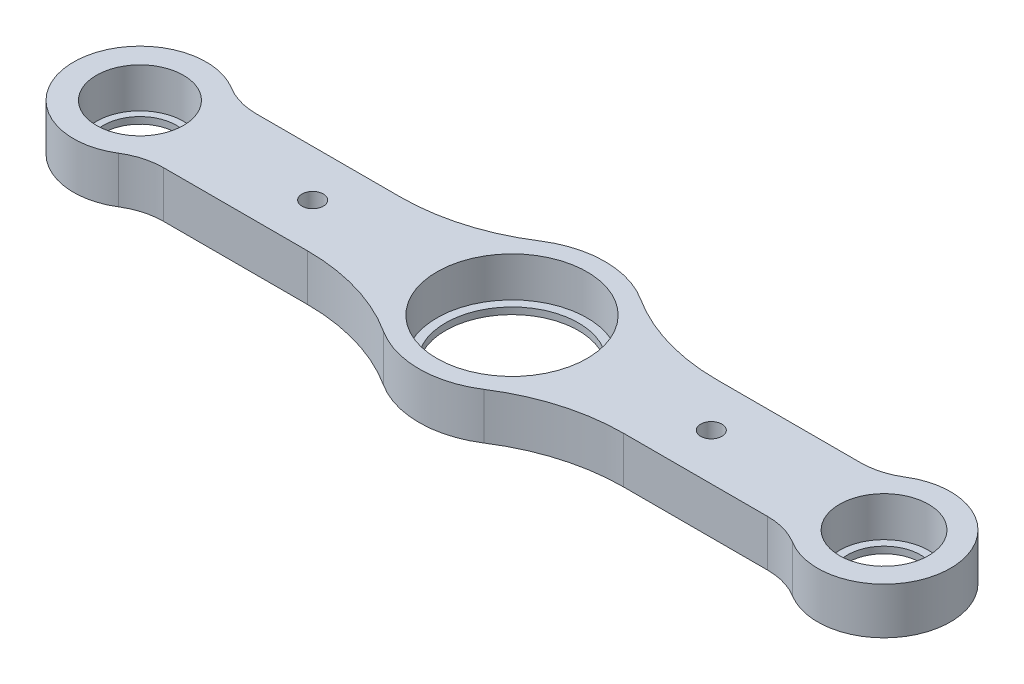
ISO-10303-21;
HEADER;
FILE_DESCRIPTION(('STEP AP214'),'2;1');
FILE_NAME('part.step','',(''),(''),'','','');
FILE_SCHEMA(('AUTOMOTIVE_DESIGN { 1 0 10303 214 1 1 1 1 }'));
ENDSEC;
DATA;
#1=APPLICATION_CONTEXT('core data for automotive mechanical design processes');
#2=APPLICATION_PROTOCOL_DEFINITION('international standard','automotive_design',2000,#1);
#3=PRODUCT_CONTEXT('',#1,'mechanical');
#4=PRODUCT('Part','Part','',(#3));
#5=PRODUCT_RELATED_PRODUCT_CATEGORY('part','',(#4));
#6=PRODUCT_DEFINITION_FORMATION('','',#4);
#7=PRODUCT_DEFINITION_CONTEXT('part definition',#1,'design');
#8=PRODUCT_DEFINITION('design','',#6,#7);
#9=PRODUCT_DEFINITION_SHAPE('','',#8);
#10=(LENGTH_UNIT() NAMED_UNIT(*) SI_UNIT(.MILLI.,.METRE.));
#11=(NAMED_UNIT(*) PLANE_ANGLE_UNIT() SI_UNIT($,.RADIAN.));
#12=(NAMED_UNIT(*) SI_UNIT($,.STERADIAN.) SOLID_ANGLE_UNIT());
#13=UNCERTAINTY_MEASURE_WITH_UNIT(LENGTH_MEASURE(1.E-05),#10,'distance_accuracy_value','');
#14=(GEOMETRIC_REPRESENTATION_CONTEXT(3) GLOBAL_UNCERTAINTY_ASSIGNED_CONTEXT((#13)) GLOBAL_UNIT_ASSIGNED_CONTEXT((#10,
#11,#12)) REPRESENTATION_CONTEXT('',''));
#15=CARTESIAN_POINT('',(0.,0.,0.));
#16=DIRECTION('',(0.,0.,1.));
#17=DIRECTION('',(1.,0.,0.));
#18=AXIS2_PLACEMENT_3D('',#15,#16,#17);
#19=CARTESIAN_POINT('',(0.,7.,0.));
#20=DIRECTION('',(0.,-1.,0.));
#21=DIRECTION('',(0.,0.,-1.));
#22=AXIS2_PLACEMENT_3D('',#19,#20,#21);
#23=CYLINDRICAL_SURFACE('',#22,10.);
#24=CARTESIAN_POINT('',(0.,0.,0.));
#25=DIRECTION('',(0.,1.,0.));
#26=DIRECTION('',(0.,0.,1.));
#27=AXIS2_PLACEMENT_3D('',#24,#25,#26);
#28=CIRCLE('',#27,10.);
#29=CARTESIAN_POINT('',(0.,0.,10.));
#30=VERTEX_POINT('',#29);
#31=EDGE_CURVE('E269',#30,#30,#28,.T.);
#32=ORIENTED_EDGE('',*,*,#31,.F.);
#33=EDGE_LOOP('',(#32));
#34=FACE_BOUND('',#33,.T.);
#35=CARTESIAN_POINT('',(0.,1.,0.));
#36=DIRECTION('',(0.,1.,0.));
#37=DIRECTION('',(0.,0.,1.));
#38=AXIS2_PLACEMENT_3D('',#35,#36,#37);
#39=CIRCLE('',#38,10.);
#40=CARTESIAN_POINT('',(0.,1.,10.));
#41=VERTEX_POINT('',#40);
#42=EDGE_CURVE('E37',#41,#41,#39,.T.);
#43=ORIENTED_EDGE('',*,*,#42,.T.);
#44=EDGE_LOOP('',(#43));
#45=FACE_BOUND('',#44,.T.);
#46=ADVANCED_FACE('F33',(#34,#45),#23,.F.);
#47=CARTESIAN_POINT('',(56.,7.,0.));
#48=DIRECTION('',(0.,-1.,0.));
#49=DIRECTION('',(0.,0.,-1.));
#50=AXIS2_PLACEMENT_3D('',#47,#48,#49);
#51=CYLINDRICAL_SURFACE('',#50,5.5);
#52=CARTESIAN_POINT('',(56.,0.,0.));
#53=DIRECTION('',(0.,1.,0.));
#54=DIRECTION('',(0.,0.,1.));
#55=AXIS2_PLACEMENT_3D('',#52,#53,#54);
#56=CIRCLE('',#55,5.5);
#57=CARTESIAN_POINT('',(56.,0.,5.5));
#58=VERTEX_POINT('',#57);
#59=EDGE_CURVE('E185',#58,#58,#56,.T.);
#60=ORIENTED_EDGE('',*,*,#59,.F.);
#61=EDGE_LOOP('',(#60));
#62=FACE_BOUND('',#61,.T.);
#63=CARTESIAN_POINT('',(56.,1.,0.));
#64=DIRECTION('',(0.,1.,0.));
#65=DIRECTION('',(0.,0.,1.));
#66=AXIS2_PLACEMENT_3D('',#63,#64,#65);
#67=CIRCLE('',#66,5.5);
#68=CARTESIAN_POINT('',(56.,1.,5.5));
#69=VERTEX_POINT('',#68);
#70=EDGE_CURVE('E250',#69,#69,#67,.T.);
#71=ORIENTED_EDGE('',*,*,#70,.T.);
#72=EDGE_LOOP('',(#71));
#73=FACE_BOUND('',#72,.T.);
#74=ADVANCED_FACE('F332',(#62,#73),#51,.F.);
#75=CARTESIAN_POINT('',(-56.,7.,0.));
#76=DIRECTION('',(0.,-1.,0.));
#77=DIRECTION('',(0.,0.,-1.));
#78=AXIS2_PLACEMENT_3D('',#75,#76,#77);
#79=CYLINDRICAL_SURFACE('',#78,5.5);
#80=CARTESIAN_POINT('',(-56.,0.,0.));
#81=DIRECTION('',(0.,1.,0.));
#82=DIRECTION('',(0.,0.,-1.));
#83=AXIS2_PLACEMENT_3D('',#80,#81,#82);
#84=CIRCLE('',#83,5.5);
#85=CARTESIAN_POINT('',(-56.,0.,-5.49999999999998));
#86=VERTEX_POINT('',#85);
#87=EDGE_CURVE('E274',#86,#86,#84,.T.);
#88=ORIENTED_EDGE('',*,*,#87,.F.);
#89=EDGE_LOOP('',(#88));
#90=FACE_BOUND('',#89,.T.);
#91=CARTESIAN_POINT('',(-56.,1.,0.));
#92=DIRECTION('',(0.,1.,0.));
#93=DIRECTION('',(0.,0.,1.));
#94=AXIS2_PLACEMENT_3D('',#91,#92,#93);
#95=CIRCLE('',#94,5.5);
#96=CARTESIAN_POINT('',(-56.,1.,5.50000000000001));
#97=VERTEX_POINT('',#96);
#98=EDGE_CURVE('E248',#97,#97,#95,.T.);
#99=ORIENTED_EDGE('',*,*,#98,.T.);
#100=EDGE_LOOP('',(#99));
#101=FACE_BOUND('',#100,.T.);
#102=ADVANCED_FACE('F338',(#90,#101),#79,.F.);
#103=CARTESIAN_POINT('',(23.8117617995813,7.,-37.));
#104=DIRECTION('',(0.,1.,0.));
#105=DIRECTION('',(0.,0.,1.));
#106=AXIS2_PLACEMENT_3D('',#103,#104,#105);
#107=PLANE('',#106);
#108=CARTESIAN_POINT('',(0.,7.,0.));
#109=DIRECTION('',(0.,1.,0.));
#110=DIRECTION('',(0.,0.,1.));
#111=AXIS2_PLACEMENT_3D('',#108,#109,#110);
#112=CIRCLE('',#111,11.3);
#113=CARTESIAN_POINT('',(0.,7.,11.3));
#114=VERTEX_POINT('',#113);
#115=EDGE_CURVE('E521',#114,#114,#112,.T.);
#116=ORIENTED_EDGE('',*,*,#115,.F.);
#117=EDGE_LOOP('',(#116));
#118=FACE_BOUND('',#117,.T.);
#119=CARTESIAN_POINT('',(-56.,7.,0.));
#120=DIRECTION('',(0.,1.,0.));
#121=DIRECTION('',(0.,0.,1.));
#122=AXIS2_PLACEMENT_3D('',#119,#120,#121);
#123=CIRCLE('',#122,6.55);
#124=CARTESIAN_POINT('',(-56.,7.,6.55000000000001));
#125=VERTEX_POINT('',#124);
#126=EDGE_CURVE('E529',#125,#125,#123,.T.);
#127=ORIENTED_EDGE('',*,*,#126,.F.);
#128=EDGE_LOOP('',(#127));
#129=FACE_BOUND('',#128,.T.);
#130=CARTESIAN_POINT('',(56.,7.,0.));
#131=DIRECTION('',(0.,1.,0.));
#132=DIRECTION('',(0.,0.,1.));
#133=AXIS2_PLACEMENT_3D('',#130,#131,#132);
#134=CIRCLE('',#133,6.7);
#135=CARTESIAN_POINT('',(56.,7.,6.7));
#136=VERTEX_POINT('',#135);
#137=EDGE_CURVE('E523',#136,#136,#134,.T.);
#138=ORIENTED_EDGE('',*,*,#137,.F.);
#139=EDGE_LOOP('',(#138));
#140=FACE_BOUND('',#139,.T.);
#141=CARTESIAN_POINT('',(-30.,7.,0.));
#142=DIRECTION('',(0.,1.,0.));
#143=DIRECTION('',(0.,0.,1.));
#144=AXIS2_PLACEMENT_3D('',#141,#142,#143);
#145=CIRCLE('',#144,1.6);
#146=CARTESIAN_POINT('',(-30.,7.,1.6));
#147=VERTEX_POINT('',#146);
#148=EDGE_CURVE('E266',#147,#147,#145,.T.);
#149=ORIENTED_EDGE('',*,*,#148,.F.);
#150=EDGE_LOOP('',(#149));
#151=FACE_BOUND('',#150,.T.);
#152=CARTESIAN_POINT('',(23.8117617995813,7.,-37.));
#153=DIRECTION('',(0.,-1.,0.));
#154=DIRECTION('',(0.,0.,1.));
#155=AXIS2_PLACEMENT_3D('',#152,#153,#154);
#156=CIRCLE('',#155,30.);
#157=CARTESIAN_POINT('',(23.8117617995813,7.,-7.));
#158=VERTEX_POINT('',#157);
#159=CARTESIAN_POINT('',(7.57646966350315,7.,-11.7727272727273));
#160=VERTEX_POINT('',#159);
#161=EDGE_CURVE('E212',#158,#160,#156,.T.);
#162=ORIENTED_EDGE('',*,*,#161,.T.);
#163=CARTESIAN_POINT('',(0.,7.,0.));
#164=DIRECTION('',(0.,1.,0.));
#165=DIRECTION('',(0.,0.,1.));
#166=AXIS2_PLACEMENT_3D('',#163,#164,#165);
#167=CIRCLE('',#166,14.);
#168=CARTESIAN_POINT('',(-7.57646966350315,7.,-11.7727272727273));
#169=VERTEX_POINT('',#168);
#170=EDGE_CURVE('E119',#160,#169,#167,.T.);
#171=ORIENTED_EDGE('',*,*,#170,.T.);
#172=CARTESIAN_POINT('',(-23.8117617995813,7.,-37.));
#173=DIRECTION('',(0.,-1.,0.));
#174=DIRECTION('',(0.,0.,1.));
#175=AXIS2_PLACEMENT_3D('',#172,#173,#174);
#176=CIRCLE('',#175,30.);
#177=CARTESIAN_POINT('',(-23.8117617995814,7.,-6.99999999999999));
#178=VERTEX_POINT('',#177);
#179=EDGE_CURVE('E281',#169,#178,#176,.T.);
#180=ORIENTED_EDGE('',*,*,#179,.T.);
#181=DIRECTION('',(-1.,0.,0.));
#182=VECTOR('',#181,1.);
#183=CARTESIAN_POINT('',(-23.8117617995814,7.,-6.99999999999998));
#184=LINE('',#183,#182);
#185=CARTESIAN_POINT('',(-45.4643462471474,7.,-7.00000000000004));
#186=VERTEX_POINT('',#185);
#187=EDGE_CURVE('E283',#178,#186,#184,.T.);
#188=ORIENTED_EDGE('',*,*,#187,.T.);
#189=CARTESIAN_POINT('',(-45.4643462471473,7.,-17.));
#190=DIRECTION('',(0.,-1.,0.));
#191=DIRECTION('',(0.,0.,-1.));
#192=AXIS2_PLACEMENT_3D('',#189,#190,#191);
#193=CIRCLE('',#192,10.);
#194=CARTESIAN_POINT('',(-50.7321731235737,7.,-8.50000000000001));
#195=VERTEX_POINT('',#194);
#196=EDGE_CURVE('E285',#186,#195,#193,.T.);
#197=ORIENTED_EDGE('',*,*,#196,.T.);
#198=CARTESIAN_POINT('',(-56.,7.,0.));
#199=DIRECTION('',(0.,1.,0.));
#200=DIRECTION('',(0.,0.,1.));
#201=AXIS2_PLACEMENT_3D('',#198,#199,#200);
#202=CIRCLE('',#201,10.);
#203=CARTESIAN_POINT('',(-50.7321731235736,7.,8.50000000000001));
#204=VERTEX_POINT('',#203);
#205=EDGE_CURVE('E287',#195,#204,#202,.T.);
#206=ORIENTED_EDGE('',*,*,#205,.T.);
#207=CARTESIAN_POINT('',(-45.4643462471473,7.,17.));
#208=DIRECTION('',(0.,-1.,0.));
#209=DIRECTION('',(0.,0.,1.));
#210=AXIS2_PLACEMENT_3D('',#207,#208,#209);
#211=CIRCLE('',#210,10.);
#212=CARTESIAN_POINT('',(-45.4643462471473,7.,7.00000000000002));
#213=VERTEX_POINT('',#212);
#214=EDGE_CURVE('E289',#204,#213,#211,.T.);
#215=ORIENTED_EDGE('',*,*,#214,.T.);
#216=DIRECTION('',(1.,0.,0.));
#217=VECTOR('',#216,1.);
#218=CARTESIAN_POINT('',(-23.8117617995812,7.,7.00000000000002));
#219=LINE('',#218,#217);
#220=CARTESIAN_POINT('',(-23.8117617995812,7.,7.00000000000002));
#221=VERTEX_POINT('',#220);
#222=EDGE_CURVE('E291',#213,#221,#219,.T.);
#223=ORIENTED_EDGE('',*,*,#222,.T.);
#224=CARTESIAN_POINT('',(-23.8117617995813,7.,37.));
#225=DIRECTION('',(0.,-1.,0.));
#226=DIRECTION('',(0.,0.,-1.));
#227=AXIS2_PLACEMENT_3D('',#224,#225,#226);
#228=CIRCLE('',#227,30.);
#229=CARTESIAN_POINT('',(-7.57646966350314,7.,11.7727272727273));
#230=VERTEX_POINT('',#229);
#231=EDGE_CURVE('E293',#221,#230,#228,.T.);
#232=ORIENTED_EDGE('',*,*,#231,.T.);
#233=CARTESIAN_POINT('',(0.,7.,0.));
#234=DIRECTION('',(0.,1.,0.));
#235=DIRECTION('',(0.,0.,1.));
#236=AXIS2_PLACEMENT_3D('',#233,#234,#235);
#237=CIRCLE('',#236,14.);
#238=CARTESIAN_POINT('',(7.57646966350315,7.,11.7727272727273));
#239=VERTEX_POINT('',#238);
#240=EDGE_CURVE('E295',#230,#239,#237,.T.);
#241=ORIENTED_EDGE('',*,*,#240,.T.);
#242=CARTESIAN_POINT('',(23.8117617995813,7.,37.));
#243=DIRECTION('',(0.,-1.,0.));
#244=DIRECTION('',(0.,0.,-1.));
#245=AXIS2_PLACEMENT_3D('',#242,#243,#244);
#246=CIRCLE('',#245,30.);
#247=CARTESIAN_POINT('',(23.8117617995813,7.,7.00000000000001));
#248=VERTEX_POINT('',#247);
#249=EDGE_CURVE('E297',#239,#248,#246,.T.);
#250=ORIENTED_EDGE('',*,*,#249,.T.);
#251=DIRECTION('',(1.,0.,0.));
#252=VECTOR('',#251,1.);
#253=CARTESIAN_POINT('',(45.4643462471473,7.,7.00000000000001));
#254=LINE('',#253,#252);
#255=CARTESIAN_POINT('',(45.4643462471473,7.,7.00000000000001));
#256=VERTEX_POINT('',#255);
#257=EDGE_CURVE('E299',#248,#256,#254,.T.);
#258=ORIENTED_EDGE('',*,*,#257,.T.);
#259=CARTESIAN_POINT('',(45.4643462471473,7.,17.));
#260=DIRECTION('',(0.,-1.,0.));
#261=DIRECTION('',(0.,0.,-1.));
#262=AXIS2_PLACEMENT_3D('',#259,#260,#261);
#263=CIRCLE('',#262,10.);
#264=CARTESIAN_POINT('',(50.7321731235736,7.,8.5));
#265=VERTEX_POINT('',#264);
#266=EDGE_CURVE('E163',#256,#265,#263,.T.);
#267=ORIENTED_EDGE('',*,*,#266,.T.);
#268=CARTESIAN_POINT('',(56.,7.,0.));
#269=DIRECTION('',(0.,1.,0.));
#270=DIRECTION('',(0.,0.,1.));
#271=AXIS2_PLACEMENT_3D('',#268,#269,#270);
#272=CIRCLE('',#271,10.);
#273=CARTESIAN_POINT('',(50.7321731235736,7.,-8.5));
#274=VERTEX_POINT('',#273);
#275=EDGE_CURVE('E156',#265,#274,#272,.T.);
#276=ORIENTED_EDGE('',*,*,#275,.T.);
#277=CARTESIAN_POINT('',(45.4643462471473,7.,-17.));
#278=DIRECTION('',(0.,-1.,0.));
#279=DIRECTION('',(0.,0.,1.));
#280=AXIS2_PLACEMENT_3D('',#277,#278,#279);
#281=CIRCLE('',#280,10.);
#282=CARTESIAN_POINT('',(45.4643462471473,7.,-7.));
#283=VERTEX_POINT('',#282);
#284=EDGE_CURVE('E161',#274,#283,#281,.T.);
#285=ORIENTED_EDGE('',*,*,#284,.T.);
#286=DIRECTION('',(-1.,0.,0.));
#287=VECTOR('',#286,1.);
#288=CARTESIAN_POINT('',(45.4643462471473,7.,-7.));
#289=LINE('',#288,#287);
#290=EDGE_CURVE('E52',#283,#158,#289,.T.);
#291=ORIENTED_EDGE('',*,*,#290,.T.);
#292=EDGE_LOOP('',(#162,#171,#180,#188,#197,#206,#215,#223,#232,#241,#250,#258,#267,#276,#285,#291));
#293=FACE_BOUND('',#292,.T.);
#294=CARTESIAN_POINT('',(30.,7.,0.));
#295=DIRECTION('',(0.,1.,0.));
#296=DIRECTION('',(0.,0.,1.));
#297=AXIS2_PLACEMENT_3D('',#294,#295,#296);
#298=CIRCLE('',#297,1.6);
#299=CARTESIAN_POINT('',(30.,7.,1.6));
#300=VERTEX_POINT('',#299);
#301=EDGE_CURVE('E257',#300,#300,#298,.T.);
#302=ORIENTED_EDGE('',*,*,#301,.F.);
#303=EDGE_LOOP('',(#302));
#304=FACE_BOUND('',#303,.T.);
#305=ADVANCED_FACE('F158',(#118,#129,#140,#151,#293,#304),#107,.T.);
#306=CARTESIAN_POINT('',(23.8117617995813,0.,-37.));
#307=DIRECTION('',(0.,1.,0.));
#308=DIRECTION('',(0.,0.,1.));
#309=AXIS2_PLACEMENT_3D('',#306,#307,#308);
#310=PLANE('',#309);
#311=CARTESIAN_POINT('',(23.8117617995813,0.,-37.));
#312=DIRECTION('',(0.,-1.,0.));
#313=DIRECTION('',(0.,0.,1.));
#314=AXIS2_PLACEMENT_3D('',#311,#312,#313);
#315=CIRCLE('',#314,30.);
#316=CARTESIAN_POINT('',(23.8117617995813,0.,-7.));
#317=VERTEX_POINT('',#316);
#318=CARTESIAN_POINT('',(7.57646966350315,0.,-11.7727272727273));
#319=VERTEX_POINT('',#318);
#320=EDGE_CURVE('E181',#317,#319,#315,.T.);
#321=ORIENTED_EDGE('',*,*,#320,.F.);
#322=DIRECTION('',(-1.,0.,0.));
#323=VECTOR('',#322,1.);
#324=CARTESIAN_POINT('',(45.4643462471473,0.,-7.));
#325=LINE('',#324,#323);
#326=CARTESIAN_POINT('',(45.4643462471473,0.,-7.));
#327=VERTEX_POINT('',#326);
#328=EDGE_CURVE('E111',#327,#317,#325,.T.);
#329=ORIENTED_EDGE('',*,*,#328,.F.);
#330=CARTESIAN_POINT('',(45.4643462471473,0.,-17.));
#331=DIRECTION('',(0.,-1.,0.));
#332=DIRECTION('',(0.,0.,1.));
#333=AXIS2_PLACEMENT_3D('',#330,#331,#332);
#334=CIRCLE('',#333,10.);
#335=CARTESIAN_POINT('',(50.7321731235736,0.,-8.5));
#336=VERTEX_POINT('',#335);
#337=EDGE_CURVE('E105',#336,#327,#334,.T.);
#338=ORIENTED_EDGE('',*,*,#337,.F.);
#339=CARTESIAN_POINT('',(56.,0.,0.));
#340=DIRECTION('',(0.,1.,0.));
#341=DIRECTION('',(0.,0.,1.));
#342=AXIS2_PLACEMENT_3D('',#339,#340,#341);
#343=CIRCLE('',#342,10.);
#344=CARTESIAN_POINT('',(50.7321731235736,0.,8.5));
#345=VERTEX_POINT('',#344);
#346=EDGE_CURVE('E171',#345,#336,#343,.T.);
#347=ORIENTED_EDGE('',*,*,#346,.F.);
#348=CARTESIAN_POINT('',(45.4643462471473,0.,17.));
#349=DIRECTION('',(0.,-1.,0.));
#350=DIRECTION('',(0.,0.,-1.));
#351=AXIS2_PLACEMENT_3D('',#348,#349,#350);
#352=CIRCLE('',#351,10.);
#353=CARTESIAN_POINT('',(45.4643462471473,0.,7.00000000000001));
#354=VERTEX_POINT('',#353);
#355=EDGE_CURVE('E207',#354,#345,#352,.T.);
#356=ORIENTED_EDGE('',*,*,#355,.F.);
#357=DIRECTION('',(1.,0.,0.));
#358=VECTOR('',#357,1.);
#359=CARTESIAN_POINT('',(45.4643462471473,0.,7.00000000000001));
#360=LINE('',#359,#358);
#361=CARTESIAN_POINT('',(23.8117617995813,0.,7.00000000000001));
#362=VERTEX_POINT('',#361);
#363=EDGE_CURVE('E205',#362,#354,#360,.T.);
#364=ORIENTED_EDGE('',*,*,#363,.F.);
#365=CARTESIAN_POINT('',(23.8117617995813,0.,37.));
#366=DIRECTION('',(0.,-1.,0.));
#367=DIRECTION('',(0.,0.,-1.));
#368=AXIS2_PLACEMENT_3D('',#365,#366,#367);
#369=CIRCLE('',#368,30.);
#370=CARTESIAN_POINT('',(7.57646966350315,0.,11.7727272727273));
#371=VERTEX_POINT('',#370);
#372=EDGE_CURVE('E203',#371,#362,#369,.T.);
#373=ORIENTED_EDGE('',*,*,#372,.F.);
#374=CARTESIAN_POINT('',(0.,0.,0.));
#375=DIRECTION('',(0.,1.,0.));
#376=DIRECTION('',(0.,0.,1.));
#377=AXIS2_PLACEMENT_3D('',#374,#375,#376);
#378=CIRCLE('',#377,14.);
#379=CARTESIAN_POINT('',(-7.57646966350314,0.,11.7727272727273));
#380=VERTEX_POINT('',#379);
#381=EDGE_CURVE('E201',#380,#371,#378,.T.);
#382=ORIENTED_EDGE('',*,*,#381,.F.);
#383=CARTESIAN_POINT('',(-23.8117617995813,0.,37.));
#384=DIRECTION('',(0.,-1.,0.));
#385=DIRECTION('',(0.,0.,-1.));
#386=AXIS2_PLACEMENT_3D('',#383,#384,#385);
#387=CIRCLE('',#386,30.);
#388=CARTESIAN_POINT('',(-23.8117617995812,0.,7.00000000000002));
#389=VERTEX_POINT('',#388);
#390=EDGE_CURVE('E199',#389,#380,#387,.T.);
#391=ORIENTED_EDGE('',*,*,#390,.F.);
#392=DIRECTION('',(1.,0.,0.));
#393=VECTOR('',#392,1.);
#394=CARTESIAN_POINT('',(-23.8117617995812,0.,7.00000000000002));
#395=LINE('',#394,#393);
#396=CARTESIAN_POINT('',(-45.4643462471473,0.,7.00000000000002));
#397=VERTEX_POINT('',#396);
#398=EDGE_CURVE('E197',#397,#389,#395,.T.);
#399=ORIENTED_EDGE('',*,*,#398,.F.);
#400=CARTESIAN_POINT('',(-45.4643462471473,0.,17.));
#401=DIRECTION('',(0.,-1.,0.));
#402=DIRECTION('',(0.,0.,1.));
#403=AXIS2_PLACEMENT_3D('',#400,#401,#402);
#404=CIRCLE('',#403,10.);
#405=CARTESIAN_POINT('',(-50.7321731235736,0.,8.50000000000001));
#406=VERTEX_POINT('',#405);
#407=EDGE_CURVE('E195',#406,#397,#404,.T.);
#408=ORIENTED_EDGE('',*,*,#407,.F.);
#409=CARTESIAN_POINT('',(-56.,0.,0.));
#410=DIRECTION('',(0.,1.,0.));
#411=DIRECTION('',(0.,0.,1.));
#412=AXIS2_PLACEMENT_3D('',#409,#410,#411);
#413=CIRCLE('',#412,10.);
#414=CARTESIAN_POINT('',(-50.7321731235737,0.,-8.50000000000001));
#415=VERTEX_POINT('',#414);
#416=EDGE_CURVE('E193',#415,#406,#413,.T.);
#417=ORIENTED_EDGE('',*,*,#416,.F.);
#418=CARTESIAN_POINT('',(-45.4643462471473,0.,-17.));
#419=DIRECTION('',(0.,-1.,0.));
#420=DIRECTION('',(0.,0.,-1.));
#421=AXIS2_PLACEMENT_3D('',#418,#419,#420);
#422=CIRCLE('',#421,10.);
#423=CARTESIAN_POINT('',(-45.4643462471474,0.,-7.00000000000004));
#424=VERTEX_POINT('',#423);
#425=EDGE_CURVE('E191',#424,#415,#422,.T.);
#426=ORIENTED_EDGE('',*,*,#425,.F.);
#427=DIRECTION('',(-1.,0.,0.));
#428=VECTOR('',#427,1.);
#429=CARTESIAN_POINT('',(-23.8117617995814,0.,-6.99999999999998));
#430=LINE('',#429,#428);
#431=CARTESIAN_POINT('',(-23.8117617995814,0.,-6.99999999999999));
#432=VERTEX_POINT('',#431);
#433=EDGE_CURVE('E189',#432,#424,#430,.T.);
#434=ORIENTED_EDGE('',*,*,#433,.F.);
#435=CARTESIAN_POINT('',(-23.8117617995813,0.,-37.));
#436=DIRECTION('',(0.,-1.,0.));
#437=DIRECTION('',(0.,0.,1.));
#438=AXIS2_PLACEMENT_3D('',#435,#436,#437);
#439=CIRCLE('',#438,30.);
#440=CARTESIAN_POINT('',(-7.57646966350315,0.,-11.7727272727273));
#441=VERTEX_POINT('',#440);
#442=EDGE_CURVE('E187',#441,#432,#439,.T.);
#443=ORIENTED_EDGE('',*,*,#442,.F.);
#444=CARTESIAN_POINT('',(0.,0.,0.));
#445=DIRECTION('',(0.,1.,0.));
#446=DIRECTION('',(0.,0.,1.));
#447=AXIS2_PLACEMENT_3D('',#444,#445,#446);
#448=CIRCLE('',#447,14.);
#449=EDGE_CURVE('E184',#319,#441,#448,.T.);
#450=ORIENTED_EDGE('',*,*,#449,.F.);
#451=EDGE_LOOP('',(#321,#329,#338,#347,#356,#364,#373,#382,#391,#399,#408,#417,#426,#434,#443,#450));
#452=FACE_BOUND('',#451,.T.);
#453=ORIENTED_EDGE('',*,*,#59,.T.);
#454=EDGE_LOOP('',(#453));
#455=FACE_BOUND('',#454,.T.);
#456=ORIENTED_EDGE('',*,*,#87,.T.);
#457=EDGE_LOOP('',(#456));
#458=FACE_BOUND('',#457,.T.);
#459=ORIENTED_EDGE('',*,*,#31,.T.);
#460=EDGE_LOOP('',(#459));
#461=FACE_BOUND('',#460,.T.);
#462=CARTESIAN_POINT('',(-30.,0.,0.));
#463=DIRECTION('',(0.,1.,0.));
#464=DIRECTION('',(0.,0.,1.));
#465=AXIS2_PLACEMENT_3D('',#462,#463,#464);
#466=CIRCLE('',#465,1.6);
#467=CARTESIAN_POINT('',(-30.,0.,1.6));
#468=VERTEX_POINT('',#467);
#469=EDGE_CURVE('E262',#468,#468,#466,.T.);
#470=ORIENTED_EDGE('',*,*,#469,.T.);
#471=EDGE_LOOP('',(#470));
#472=FACE_BOUND('',#471,.T.);
#473=CARTESIAN_POINT('',(30.,0.,0.));
#474=DIRECTION('',(0.,1.,0.));
#475=DIRECTION('',(0.,0.,1.));
#476=AXIS2_PLACEMENT_3D('',#473,#474,#475);
#477=CIRCLE('',#476,1.6);
#478=CARTESIAN_POINT('',(30.,0.,1.6));
#479=VERTEX_POINT('',#478);
#480=EDGE_CURVE('E253',#479,#479,#477,.T.);
#481=ORIENTED_EDGE('',*,*,#480,.T.);
#482=EDGE_LOOP('',(#481));
#483=FACE_BOUND('',#482,.T.);
#484=ADVANCED_FACE('F312',(#452,#455,#458,#461,#472,#483),#310,.F.);
#485=CARTESIAN_POINT('',(23.8117617995813,7.,-37.));
#486=DIRECTION('',(0.,-1.,0.));
#487=DIRECTION('',(0.,0.,-1.));
#488=AXIS2_PLACEMENT_3D('',#485,#486,#487);
#489=CYLINDRICAL_SURFACE('',#488,30.);
#490=ORIENTED_EDGE('',*,*,#320,.T.);
#491=DIRECTION('',(0.,-1.,0.));
#492=VECTOR('',#491,1.);
#493=CARTESIAN_POINT('',(7.57646966350315,7.,-11.7727272727273));
#494=LINE('',#493,#492);
#495=EDGE_CURVE('E11',#160,#319,#494,.T.);
#496=ORIENTED_EDGE('',*,*,#495,.F.);
#497=ORIENTED_EDGE('',*,*,#161,.F.);
#498=DIRECTION('',(0.,-1.,0.));
#499=VECTOR('',#498,1.);
#500=CARTESIAN_POINT('',(23.8117617995813,7.,-7.));
#501=LINE('',#500,#499);
#502=EDGE_CURVE('E177',#158,#317,#501,.T.);
#503=ORIENTED_EDGE('',*,*,#502,.T.);
#504=EDGE_LOOP('',(#490,#496,#497,#503));
#505=FACE_BOUND('',#504,.T.);
#506=ADVANCED_FACE('F35',(#505),#489,.F.);
#507=CARTESIAN_POINT('',(0.,7.,0.));
#508=DIRECTION('',(0.,-1.,0.));
#509=DIRECTION('',(0.,0.,-1.));
#510=AXIS2_PLACEMENT_3D('',#507,#508,#509);
#511=CYLINDRICAL_SURFACE('',#510,14.);
#512=ORIENTED_EDGE('',*,*,#449,.T.);
#513=DIRECTION('',(0.,-1.,0.));
#514=VECTOR('',#513,1.);
#515=CARTESIAN_POINT('',(-7.57646966350315,7.,-11.7727272727273));
#516=LINE('',#515,#514);
#517=EDGE_CURVE('E43',#169,#441,#516,.T.);
#518=ORIENTED_EDGE('',*,*,#517,.F.);
#519=ORIENTED_EDGE('',*,*,#170,.F.);
#520=ORIENTED_EDGE('',*,*,#495,.T.);
#521=EDGE_LOOP('',(#512,#518,#519,#520));
#522=FACE_BOUND('',#521,.T.);
#523=ADVANCED_FACE('F354',(#522),#511,.T.);
#524=CARTESIAN_POINT('',(-23.8117617995813,7.,-37.));
#525=DIRECTION('',(0.,-1.,0.));
#526=DIRECTION('',(0.,0.,-1.));
#527=AXIS2_PLACEMENT_3D('',#524,#525,#526);
#528=CYLINDRICAL_SURFACE('',#527,30.);
#529=ORIENTED_EDGE('',*,*,#442,.T.);
#530=DIRECTION('',(0.,-1.,0.));
#531=VECTOR('',#530,1.);
#532=CARTESIAN_POINT('',(-23.8117617995814,7.,-6.99999999999999));
#533=LINE('',#532,#531);
#534=EDGE_CURVE('E243',#178,#432,#533,.T.);
#535=ORIENTED_EDGE('',*,*,#534,.F.);
#536=ORIENTED_EDGE('',*,*,#179,.F.);
#537=ORIENTED_EDGE('',*,*,#517,.T.);
#538=EDGE_LOOP('',(#529,#535,#536,#537));
#539=FACE_BOUND('',#538,.T.);
#540=ADVANCED_FACE('F358',(#539),#528,.F.);
#541=CARTESIAN_POINT('',(-23.8117617995814,7.,-6.99999999999998));
#542=DIRECTION('',(0.,0.,1.));
#543=DIRECTION('',(1.,0.,0.));
#544=AXIS2_PLACEMENT_3D('',#541,#542,#543);
#545=PLANE('',#544);
#546=ORIENTED_EDGE('',*,*,#433,.T.);
#547=DIRECTION('',(0.,-1.,0.));
#548=VECTOR('',#547,1.);
#549=CARTESIAN_POINT('',(-45.4643462471474,7.,-7.00000000000004));
#550=LINE('',#549,#548);
#551=EDGE_CURVE('E240',#186,#424,#550,.T.);
#552=ORIENTED_EDGE('',*,*,#551,.F.);
#553=ORIENTED_EDGE('',*,*,#187,.F.);
#554=ORIENTED_EDGE('',*,*,#534,.T.);
#555=EDGE_LOOP('',(#546,#552,#553,#554));
#556=FACE_BOUND('',#555,.T.);
#557=ADVANCED_FACE('F362',(#556),#545,.F.);
#558=CARTESIAN_POINT('',(-45.4643462471473,7.,-17.));
#559=DIRECTION('',(0.,-1.,0.));
#560=DIRECTION('',(0.,0.,-1.));
#561=AXIS2_PLACEMENT_3D('',#558,#559,#560);
#562=CYLINDRICAL_SURFACE('',#561,10.);
#563=ORIENTED_EDGE('',*,*,#425,.T.);
#564=DIRECTION('',(0.,-1.,0.));
#565=VECTOR('',#564,1.);
#566=CARTESIAN_POINT('',(-50.7321731235737,7.,-8.50000000000001));
#567=LINE('',#566,#565);
#568=EDGE_CURVE('E237',#195,#415,#567,.T.);
#569=ORIENTED_EDGE('',*,*,#568,.F.);
#570=ORIENTED_EDGE('',*,*,#196,.F.);
#571=ORIENTED_EDGE('',*,*,#551,.T.);
#572=EDGE_LOOP('',(#563,#569,#570,#571));
#573=FACE_BOUND('',#572,.T.);
#574=ADVANCED_FACE('F368',(#573),#562,.F.);
#575=CARTESIAN_POINT('',(-56.,7.,0.));
#576=DIRECTION('',(0.,-1.,0.));
#577=DIRECTION('',(0.,0.,-1.));
#578=AXIS2_PLACEMENT_3D('',#575,#576,#577);
#579=CYLINDRICAL_SURFACE('',#578,10.);
#580=ORIENTED_EDGE('',*,*,#416,.T.);
#581=DIRECTION('',(0.,-1.,0.));
#582=VECTOR('',#581,1.);
#583=CARTESIAN_POINT('',(-50.7321731235736,7.,8.50000000000001));
#584=LINE('',#583,#582);
#585=EDGE_CURVE('E234',#204,#406,#584,.T.);
#586=ORIENTED_EDGE('',*,*,#585,.F.);
#587=ORIENTED_EDGE('',*,*,#205,.F.);
#588=ORIENTED_EDGE('',*,*,#568,.T.);
#589=EDGE_LOOP('',(#580,#586,#587,#588));
#590=FACE_BOUND('',#589,.T.);
#591=ADVANCED_FACE('F372',(#590),#579,.T.);
#592=CARTESIAN_POINT('',(-45.4643462471473,7.,17.));
#593=DIRECTION('',(0.,-1.,0.));
#594=DIRECTION('',(0.,0.,-1.));
#595=AXIS2_PLACEMENT_3D('',#592,#593,#594);
#596=CYLINDRICAL_SURFACE('',#595,10.);
#597=ORIENTED_EDGE('',*,*,#407,.T.);
#598=DIRECTION('',(0.,-1.,0.));
#599=VECTOR('',#598,1.);
#600=CARTESIAN_POINT('',(-45.4643462471473,7.,7.00000000000002));
#601=LINE('',#600,#599);
#602=EDGE_CURVE('E231',#213,#397,#601,.T.);
#603=ORIENTED_EDGE('',*,*,#602,.F.);
#604=ORIENTED_EDGE('',*,*,#214,.F.);
#605=ORIENTED_EDGE('',*,*,#585,.T.);
#606=EDGE_LOOP('',(#597,#603,#604,#605));
#607=FACE_BOUND('',#606,.T.);
#608=ADVANCED_FACE('F376',(#607),#596,.F.);
#609=CARTESIAN_POINT('',(-23.8117617995812,7.,7.00000000000002));
#610=DIRECTION('',(0.,0.,-1.));
#611=DIRECTION('',(-1.,0.,0.));
#612=AXIS2_PLACEMENT_3D('',#609,#610,#611);
#613=PLANE('',#612);
#614=ORIENTED_EDGE('',*,*,#398,.T.);
#615=DIRECTION('',(0.,-1.,0.));
#616=VECTOR('',#615,1.);
#617=CARTESIAN_POINT('',(-23.8117617995812,7.,7.00000000000002));
#618=LINE('',#617,#616);
#619=EDGE_CURVE('E228',#221,#389,#618,.T.);
#620=ORIENTED_EDGE('',*,*,#619,.F.);
#621=ORIENTED_EDGE('',*,*,#222,.F.);
#622=ORIENTED_EDGE('',*,*,#602,.T.);
#623=EDGE_LOOP('',(#614,#620,#621,#622));
#624=FACE_BOUND('',#623,.T.);
#625=ADVANCED_FACE('F380',(#624),#613,.F.);
#626=CARTESIAN_POINT('',(-23.8117617995813,7.,37.));
#627=DIRECTION('',(0.,-1.,0.));
#628=DIRECTION('',(0.,0.,-1.));
#629=AXIS2_PLACEMENT_3D('',#626,#627,#628);
#630=CYLINDRICAL_SURFACE('',#629,30.);
#631=ORIENTED_EDGE('',*,*,#390,.T.);
#632=DIRECTION('',(0.,-1.,0.));
#633=VECTOR('',#632,1.);
#634=CARTESIAN_POINT('',(-7.57646966350314,7.,11.7727272727273));
#635=LINE('',#634,#633);
#636=EDGE_CURVE('E225',#230,#380,#635,.T.);
#637=ORIENTED_EDGE('',*,*,#636,.F.);
#638=ORIENTED_EDGE('',*,*,#231,.F.);
#639=ORIENTED_EDGE('',*,*,#619,.T.);
#640=EDGE_LOOP('',(#631,#637,#638,#639));
#641=FACE_BOUND('',#640,.T.);
#642=ADVANCED_FACE('F384',(#641),#630,.F.);
#643=CARTESIAN_POINT('',(0.,7.,0.));
#644=DIRECTION('',(0.,-1.,0.));
#645=DIRECTION('',(0.,0.,-1.));
#646=AXIS2_PLACEMENT_3D('',#643,#644,#645);
#647=CYLINDRICAL_SURFACE('',#646,14.);
#648=ORIENTED_EDGE('',*,*,#381,.T.);
#649=DIRECTION('',(0.,-1.,0.));
#650=VECTOR('',#649,1.);
#651=CARTESIAN_POINT('',(7.57646966350315,7.,11.7727272727273));
#652=LINE('',#651,#650);
#653=EDGE_CURVE('E222',#239,#371,#652,.T.);
#654=ORIENTED_EDGE('',*,*,#653,.F.);
#655=ORIENTED_EDGE('',*,*,#240,.F.);
#656=ORIENTED_EDGE('',*,*,#636,.T.);
#657=EDGE_LOOP('',(#648,#654,#655,#656));
#658=FACE_BOUND('',#657,.T.);
#659=ADVANCED_FACE('F388',(#658),#647,.T.);
#660=CARTESIAN_POINT('',(23.8117617995813,7.,37.));
#661=DIRECTION('',(0.,-1.,0.));
#662=DIRECTION('',(0.,0.,-1.));
#663=AXIS2_PLACEMENT_3D('',#660,#661,#662);
#664=CYLINDRICAL_SURFACE('',#663,30.);
#665=ORIENTED_EDGE('',*,*,#372,.T.);
#666=DIRECTION('',(0.,-1.,0.));
#667=VECTOR('',#666,1.);
#668=CARTESIAN_POINT('',(23.8117617995813,7.,7.00000000000001));
#669=LINE('',#668,#667);
#670=EDGE_CURVE('E219',#248,#362,#669,.T.);
#671=ORIENTED_EDGE('',*,*,#670,.F.);
#672=ORIENTED_EDGE('',*,*,#249,.F.);
#673=ORIENTED_EDGE('',*,*,#653,.T.);
#674=EDGE_LOOP('',(#665,#671,#672,#673));
#675=FACE_BOUND('',#674,.T.);
#676=ADVANCED_FACE('F392',(#675),#664,.F.);
#677=CARTESIAN_POINT('',(45.4643462471473,7.,7.00000000000001));
#678=DIRECTION('',(0.,0.,-1.));
#679=DIRECTION('',(-1.,0.,0.));
#680=AXIS2_PLACEMENT_3D('',#677,#678,#679);
#681=PLANE('',#680);
#682=ORIENTED_EDGE('',*,*,#363,.T.);
#683=DIRECTION('',(0.,-1.,0.));
#684=VECTOR('',#683,1.);
#685=CARTESIAN_POINT('',(45.4643462471473,7.,7.00000000000001));
#686=LINE('',#685,#684);
#687=EDGE_CURVE('E216',#256,#354,#686,.T.);
#688=ORIENTED_EDGE('',*,*,#687,.F.);
#689=ORIENTED_EDGE('',*,*,#257,.F.);
#690=ORIENTED_EDGE('',*,*,#670,.T.);
#691=EDGE_LOOP('',(#682,#688,#689,#690));
#692=FACE_BOUND('',#691,.T.);
#693=ADVANCED_FACE('F305',(#692),#681,.F.);
#694=CARTESIAN_POINT('',(45.4643462471473,7.,17.));
#695=DIRECTION('',(0.,-1.,0.));
#696=DIRECTION('',(0.,0.,-1.));
#697=AXIS2_PLACEMENT_3D('',#694,#695,#696);
#698=CYLINDRICAL_SURFACE('',#697,10.);
#699=ORIENTED_EDGE('',*,*,#355,.T.);
#700=DIRECTION('',(0.,-1.,0.));
#701=VECTOR('',#700,1.);
#702=CARTESIAN_POINT('',(50.7321731235736,7.,8.5));
#703=LINE('',#702,#701);
#704=EDGE_CURVE('E172',#265,#345,#703,.T.);
#705=ORIENTED_EDGE('',*,*,#704,.F.);
#706=ORIENTED_EDGE('',*,*,#266,.F.);
#707=ORIENTED_EDGE('',*,*,#687,.T.);
#708=EDGE_LOOP('',(#699,#705,#706,#707));
#709=FACE_BOUND('',#708,.T.);
#710=ADVANCED_FACE('F309',(#709),#698,.F.);
#711=CARTESIAN_POINT('',(56.,7.,0.));
#712=DIRECTION('',(0.,-1.,0.));
#713=DIRECTION('',(0.,0.,-1.));
#714=AXIS2_PLACEMENT_3D('',#711,#712,#713);
#715=CYLINDRICAL_SURFACE('',#714,10.);
#716=ORIENTED_EDGE('',*,*,#346,.T.);
#717=DIRECTION('',(0.,-1.,0.));
#718=VECTOR('',#717,1.);
#719=CARTESIAN_POINT('',(50.7321731235736,7.,-8.5));
#720=LINE('',#719,#718);
#721=EDGE_CURVE('E168',#274,#336,#720,.T.);
#722=ORIENTED_EDGE('',*,*,#721,.F.);
#723=ORIENTED_EDGE('',*,*,#275,.F.);
#724=ORIENTED_EDGE('',*,*,#704,.T.);
#725=EDGE_LOOP('',(#716,#722,#723,#724));
#726=FACE_BOUND('',#725,.T.);
#727=ADVANCED_FACE('F169',(#726),#715,.T.);
#728=CARTESIAN_POINT('',(45.4643462471473,7.,-17.));
#729=DIRECTION('',(0.,-1.,0.));
#730=DIRECTION('',(0.,0.,-1.));
#731=AXIS2_PLACEMENT_3D('',#728,#729,#730);
#732=CYLINDRICAL_SURFACE('',#731,10.);
#733=ORIENTED_EDGE('',*,*,#337,.T.);
#734=DIRECTION('',(0.,-1.,0.));
#735=VECTOR('',#734,1.);
#736=CARTESIAN_POINT('',(45.4643462471473,7.,-7.));
#737=LINE('',#736,#735);
#738=EDGE_CURVE('E173',#283,#327,#737,.T.);
#739=ORIENTED_EDGE('',*,*,#738,.F.);
#740=ORIENTED_EDGE('',*,*,#284,.F.);
#741=ORIENTED_EDGE('',*,*,#721,.T.);
#742=EDGE_LOOP('',(#733,#739,#740,#741));
#743=FACE_BOUND('',#742,.T.);
#744=ADVANCED_FACE('F175',(#743),#732,.F.);
#745=CARTESIAN_POINT('',(45.4643462471473,7.,-7.));
#746=DIRECTION('',(0.,0.,1.));
#747=DIRECTION('',(1.,0.,0.));
#748=AXIS2_PLACEMENT_3D('',#745,#746,#747);
#749=PLANE('',#748);
#750=ORIENTED_EDGE('',*,*,#328,.T.);
#751=ORIENTED_EDGE('',*,*,#502,.F.);
#752=ORIENTED_EDGE('',*,*,#290,.F.);
#753=ORIENTED_EDGE('',*,*,#738,.T.);
#754=EDGE_LOOP('',(#750,#751,#752,#753));
#755=FACE_BOUND('',#754,.T.);
#756=ADVANCED_FACE('F318',(#755),#749,.F.);
#757=CARTESIAN_POINT('',(-30.,7.,0.));
#758=DIRECTION('',(0.,-1.,0.));
#759=DIRECTION('',(0.,0.,-1.));
#760=AXIS2_PLACEMENT_3D('',#757,#758,#759);
#761=CYLINDRICAL_SURFACE('',#760,1.6);
#762=ORIENTED_EDGE('',*,*,#148,.T.);
#763=EDGE_LOOP('',(#762));
#764=FACE_BOUND('',#763,.T.);
#765=ORIENTED_EDGE('',*,*,#469,.F.);
#766=EDGE_LOOP('',(#765));
#767=FACE_BOUND('',#766,.T.);
#768=ADVANCED_FACE('F320',(#764,#767),#761,.F.);
#769=CARTESIAN_POINT('',(30.,7.,0.));
#770=DIRECTION('',(0.,-1.,0.));
#771=DIRECTION('',(0.,0.,-1.));
#772=AXIS2_PLACEMENT_3D('',#769,#770,#771);
#773=CYLINDRICAL_SURFACE('',#772,1.6);
#774=ORIENTED_EDGE('',*,*,#301,.T.);
#775=EDGE_LOOP('',(#774));
#776=FACE_BOUND('',#775,.T.);
#777=ORIENTED_EDGE('',*,*,#480,.F.);
#778=EDGE_LOOP('',(#777));
#779=FACE_BOUND('',#778,.T.);
#780=ADVANCED_FACE('F326',(#776,#779),#773,.F.);
#781=CARTESIAN_POINT('',(-56.,1.,0.));
#782=DIRECTION('',(0.,1.,0.));
#783=DIRECTION('',(0.,0.,1.));
#784=AXIS2_PLACEMENT_3D('',#781,#782,#783);
#785=CYLINDRICAL_SURFACE('',#784,6.55);
#786=CARTESIAN_POINT('',(-56.,1.,0.));
#787=DIRECTION('',(0.,1.,0.));
#788=DIRECTION('',(0.,0.,1.));
#789=AXIS2_PLACEMENT_3D('',#786,#787,#788);
#790=CIRCLE('',#789,6.55);
#791=CARTESIAN_POINT('',(-56.,1.,6.55000000000001));
#792=VERTEX_POINT('',#791);
#793=EDGE_CURVE('E251',#792,#792,#790,.T.);
#794=ORIENTED_EDGE('',*,*,#793,.F.);
#795=EDGE_LOOP('',(#794));
#796=FACE_BOUND('',#795,.T.);
#797=ORIENTED_EDGE('',*,*,#126,.T.);
#798=EDGE_LOOP('',(#797));
#799=FACE_BOUND('',#798,.T.);
#800=ADVANCED_FACE('F429',(#796,#799),#785,.F.);
#801=CARTESIAN_POINT('',(-56.,1.,0.));
#802=DIRECTION('',(0.,1.,0.));
#803=DIRECTION('',(0.,0.,1.));
#804=AXIS2_PLACEMENT_3D('',#801,#802,#803);
#805=PLANE('',#804);
#806=ORIENTED_EDGE('',*,*,#98,.F.);
#807=EDGE_LOOP('',(#806));
#808=FACE_BOUND('',#807,.T.);
#809=ORIENTED_EDGE('',*,*,#793,.T.);
#810=EDGE_LOOP('',(#809));
#811=FACE_BOUND('',#810,.T.);
#812=ADVANCED_FACE('F450',(#808,#811),#805,.T.);
#813=CARTESIAN_POINT('',(56.,1.,0.));
#814=DIRECTION('',(0.,1.,0.));
#815=DIRECTION('',(0.,0.,1.));
#816=AXIS2_PLACEMENT_3D('',#813,#814,#815);
#817=CYLINDRICAL_SURFACE('',#816,6.7);
#818=CARTESIAN_POINT('',(56.,1.,0.));
#819=DIRECTION('',(0.,1.,0.));
#820=DIRECTION('',(0.,0.,1.));
#821=AXIS2_PLACEMENT_3D('',#818,#819,#820);
#822=CIRCLE('',#821,6.7);
#823=CARTESIAN_POINT('',(56.,1.,6.7));
#824=VERTEX_POINT('',#823);
#825=EDGE_CURVE('E532',#824,#824,#822,.T.);
#826=ORIENTED_EDGE('',*,*,#825,.F.);
#827=EDGE_LOOP('',(#826));
#828=FACE_BOUND('',#827,.T.);
#829=ORIENTED_EDGE('',*,*,#137,.T.);
#830=EDGE_LOOP('',(#829));
#831=FACE_BOUND('',#830,.T.);
#832=ADVANCED_FACE('F460',(#828,#831),#817,.F.);
#833=CARTESIAN_POINT('',(56.,1.,0.));
#834=DIRECTION('',(0.,1.,0.));
#835=DIRECTION('',(0.,0.,1.));
#836=AXIS2_PLACEMENT_3D('',#833,#834,#835);
#837=PLANE('',#836);
#838=ORIENTED_EDGE('',*,*,#70,.F.);
#839=EDGE_LOOP('',(#838));
#840=FACE_BOUND('',#839,.T.);
#841=ORIENTED_EDGE('',*,*,#825,.T.);
#842=EDGE_LOOP('',(#841));
#843=FACE_BOUND('',#842,.T.);
#844=ADVANCED_FACE('F470',(#840,#843),#837,.T.);
#845=CARTESIAN_POINT('',(0.,1.,0.));
#846=DIRECTION('',(0.,1.,0.));
#847=DIRECTION('',(0.,0.,1.));
#848=AXIS2_PLACEMENT_3D('',#845,#846,#847);
#849=CYLINDRICAL_SURFACE('',#848,11.3);
#850=CARTESIAN_POINT('',(0.,1.,0.));
#851=DIRECTION('',(0.,1.,0.));
#852=DIRECTION('',(0.,0.,1.));
#853=AXIS2_PLACEMENT_3D('',#850,#851,#852);
#854=CIRCLE('',#853,11.3);
#855=CARTESIAN_POINT('',(0.,1.,11.3));
#856=VERTEX_POINT('',#855);
#857=EDGE_CURVE('E520',#856,#856,#854,.T.);
#858=ORIENTED_EDGE('',*,*,#857,.F.);
#859=EDGE_LOOP('',(#858));
#860=FACE_BOUND('',#859,.T.);
#861=ORIENTED_EDGE('',*,*,#115,.T.);
#862=EDGE_LOOP('',(#861));
#863=FACE_BOUND('',#862,.T.);
#864=ADVANCED_FACE('F479',(#860,#863),#849,.F.);
#865=CARTESIAN_POINT('',(0.,1.,0.));
#866=DIRECTION('',(0.,1.,0.));
#867=DIRECTION('',(0.,0.,1.));
#868=AXIS2_PLACEMENT_3D('',#865,#866,#867);
#869=PLANE('',#868);
#870=ORIENTED_EDGE('',*,*,#42,.F.);
#871=EDGE_LOOP('',(#870));
#872=FACE_BOUND('',#871,.T.);
#873=ORIENTED_EDGE('',*,*,#857,.T.);
#874=EDGE_LOOP('',(#873));
#875=FACE_BOUND('',#874,.T.);
#876=ADVANCED_FACE('F501',(#872,#875),#869,.T.);
#877=CLOSED_SHELL('',(#46,#74,#102,#305,#484,#506,#523,#540,#557,#574,#591,#608,#625,#642,#659,
#676,#693,#710,#727,#744,#756,#768,#780,#800,#812,#832,#844,#864,#876));
#878=MANIFOLD_SOLID_BREP('B2',#877);
#879=ADVANCED_BREP_SHAPE_REPRESENTATION('',(#18,#878),#14);
#880=SHAPE_DEFINITION_REPRESENTATION(#9,#879);
ENDSEC;
END-ISO-10303-21;
